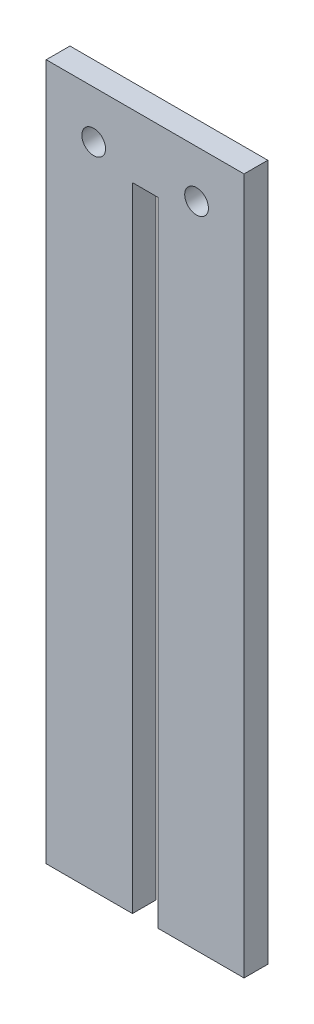
ISO-10303-21;
HEADER;
FILE_DESCRIPTION(('STEP AP214'),'2;1');
FILE_NAME('part.step','',(''),(''),'','','');
FILE_SCHEMA(('AUTOMOTIVE_DESIGN { 1 0 10303 214 1 1 1 1 }'));
ENDSEC;
DATA;
#1=APPLICATION_CONTEXT('core data for automotive mechanical design processes');
#2=APPLICATION_PROTOCOL_DEFINITION('international standard','automotive_design',2000,#1);
#3=PRODUCT_CONTEXT('',#1,'mechanical');
#4=PRODUCT('Part','Part','',(#3));
#5=PRODUCT_RELATED_PRODUCT_CATEGORY('part','',(#4));
#6=PRODUCT_DEFINITION_FORMATION('','',#4);
#7=PRODUCT_DEFINITION_CONTEXT('part definition',#1,'design');
#8=PRODUCT_DEFINITION('design','',#6,#7);
#9=PRODUCT_DEFINITION_SHAPE('','',#8);
#10=(LENGTH_UNIT() NAMED_UNIT(*) SI_UNIT(.MILLI.,.METRE.));
#11=(NAMED_UNIT(*) PLANE_ANGLE_UNIT() SI_UNIT($,.RADIAN.));
#12=(NAMED_UNIT(*) SI_UNIT($,.STERADIAN.) SOLID_ANGLE_UNIT());
#13=UNCERTAINTY_MEASURE_WITH_UNIT(LENGTH_MEASURE(1.E-05),#10,'distance_accuracy_value','');
#14=(GEOMETRIC_REPRESENTATION_CONTEXT(3) GLOBAL_UNCERTAINTY_ASSIGNED_CONTEXT((#13)) GLOBAL_UNIT_ASSIGNED_CONTEXT((#10,
#11,#12)) REPRESENTATION_CONTEXT('',''));
#15=CARTESIAN_POINT('',(0.,0.,0.));
#16=DIRECTION('',(0.,0.,1.));
#17=DIRECTION('',(1.,0.,0.));
#18=AXIS2_PLACEMENT_3D('',#15,#16,#17);
#19=CARTESIAN_POINT('',(0.,0.,3.));
#20=DIRECTION('',(0.,1.,0.));
#21=DIRECTION('',(0.,0.,1.));
#22=AXIS2_PLACEMENT_3D('',#19,#20,#21);
#23=PLANE('',#22);
#24=DIRECTION('',(1.,0.,0.));
#25=VECTOR('',#24,1.);
#26=CARTESIAN_POINT('',(0.,0.,0.));
#27=LINE('',#26,#25);
#28=CARTESIAN_POINT('',(0.,0.,0.));
#29=VERTEX_POINT('',#28);
#30=CARTESIAN_POINT('',(10.9,0.,0.));
#31=VERTEX_POINT('',#30);
#32=EDGE_CURVE('E145',#29,#31,#27,.T.);
#33=ORIENTED_EDGE('',*,*,#32,.T.);
#34=DIRECTION('',(0.,0.,1.));
#35=VECTOR('',#34,1.);
#36=CARTESIAN_POINT('',(10.9,0.,-7.));
#37=LINE('',#36,#35);
#38=CARTESIAN_POINT('',(10.9,0.,3.));
#39=VERTEX_POINT('',#38);
#40=EDGE_CURVE('E179',#31,#39,#37,.T.);
#41=ORIENTED_EDGE('',*,*,#40,.T.);
#42=DIRECTION('',(1.,0.,0.));
#43=VECTOR('',#42,1.);
#44=CARTESIAN_POINT('',(0.,0.,3.));
#45=LINE('',#44,#43);
#46=CARTESIAN_POINT('',(0.,0.,3.));
#47=VERTEX_POINT('',#46);
#48=EDGE_CURVE('E88',#47,#39,#45,.T.);
#49=ORIENTED_EDGE('',*,*,#48,.F.);
#50=DIRECTION('',(0.,0.,-1.));
#51=VECTOR('',#50,1.);
#52=CARTESIAN_POINT('',(0.,0.,3.));
#53=LINE('',#52,#51);
#54=EDGE_CURVE('E155',#47,#29,#53,.T.);
#55=ORIENTED_EDGE('',*,*,#54,.T.);
#56=EDGE_LOOP('',(#33,#41,#49,#55));
#57=FACE_BOUND('',#56,.T.);
#58=ADVANCED_FACE('F35',(#57),#23,.F.);
#59=CARTESIAN_POINT('',(0.,0.,3.));
#60=DIRECTION('',(1.,0.,0.));
#61=DIRECTION('',(0.,1.,0.));
#62=AXIS2_PLACEMENT_3D('',#59,#60,#61);
#63=PLANE('',#62);
#64=DIRECTION('',(0.,-1.,0.));
#65=VECTOR('',#64,1.);
#66=CARTESIAN_POINT('',(0.,0.,0.));
#67=LINE('',#66,#65);
#68=CARTESIAN_POINT('',(0.,88.,0.));
#69=VERTEX_POINT('',#68);
#70=EDGE_CURVE('E140',#69,#29,#67,.T.);
#71=ORIENTED_EDGE('',*,*,#70,.T.);
#72=ORIENTED_EDGE('',*,*,#54,.F.);
#73=DIRECTION('',(0.,-1.,0.));
#74=VECTOR('',#73,1.);
#75=CARTESIAN_POINT('',(0.,0.,3.));
#76=LINE('',#75,#74);
#77=CARTESIAN_POINT('',(0.,88.,3.));
#78=VERTEX_POINT('',#77);
#79=EDGE_CURVE('E131',#78,#47,#76,.T.);
#80=ORIENTED_EDGE('',*,*,#79,.F.);
#81=DIRECTION('',(0.,0.,-1.));
#82=VECTOR('',#81,1.);
#83=CARTESIAN_POINT('',(0.,88.,3.));
#84=LINE('',#83,#82);
#85=EDGE_CURVE('E139',#78,#69,#84,.T.);
#86=ORIENTED_EDGE('',*,*,#85,.T.);
#87=EDGE_LOOP('',(#71,#72,#80,#86));
#88=FACE_BOUND('',#87,.T.);
#89=ADVANCED_FACE('F37',(#88),#63,.F.);
#90=CARTESIAN_POINT('',(14.1,0.,3.));
#91=VERTEX_POINT('',#90);
#92=CARTESIAN_POINT('',(25.,0.,3.));
#93=VERTEX_POINT('',#92);
#94=EDGE_CURVE('E121',#91,#93,#45,.T.);
#95=ORIENTED_EDGE('',*,*,#94,.F.);
#96=DIRECTION('',(0.,0.,1.));
#97=VECTOR('',#96,1.);
#98=CARTESIAN_POINT('',(14.1,0.,-7.));
#99=LINE('',#98,#97);
#100=CARTESIAN_POINT('',(14.1,0.,0.));
#101=VERTEX_POINT('',#100);
#102=EDGE_CURVE('E108',#101,#91,#99,.T.);
#103=ORIENTED_EDGE('',*,*,#102,.F.);
#104=CARTESIAN_POINT('',(25.,0.,0.));
#105=VERTEX_POINT('',#104);
#106=EDGE_CURVE('E143',#101,#105,#27,.T.);
#107=ORIENTED_EDGE('',*,*,#106,.T.);
#108=DIRECTION('',(0.,0.,-1.));
#109=VECTOR('',#108,1.);
#110=CARTESIAN_POINT('',(25.,0.,3.));
#111=LINE('',#110,#109);
#112=EDGE_CURVE('E129',#93,#105,#111,.T.);
#113=ORIENTED_EDGE('',*,*,#112,.F.);
#114=EDGE_LOOP('',(#95,#103,#107,#113));
#115=FACE_BOUND('',#114,.T.);
#116=ADVANCED_FACE('F127',(#115),#23,.F.);
#117=CARTESIAN_POINT('',(25.,0.,3.));
#118=DIRECTION('',(-1.,0.,0.));
#119=DIRECTION('',(0.,-1.,0.));
#120=AXIS2_PLACEMENT_3D('',#117,#118,#119);
#121=PLANE('',#120);
#122=DIRECTION('',(0.,1.,0.));
#123=VECTOR('',#122,1.);
#124=CARTESIAN_POINT('',(25.,0.,0.));
#125=LINE('',#124,#123);
#126=CARTESIAN_POINT('',(25.,88.,0.));
#127=VERTEX_POINT('',#126);
#128=EDGE_CURVE('E148',#105,#127,#125,.T.);
#129=ORIENTED_EDGE('',*,*,#128,.T.);
#130=DIRECTION('',(0.,0.,-1.));
#131=VECTOR('',#130,1.);
#132=CARTESIAN_POINT('',(25.,88.,3.));
#133=LINE('',#132,#131);
#134=CARTESIAN_POINT('',(25.,88.,3.));
#135=VERTEX_POINT('',#134);
#136=EDGE_CURVE('E152',#135,#127,#133,.T.);
#137=ORIENTED_EDGE('',*,*,#136,.F.);
#138=DIRECTION('',(0.,1.,0.));
#139=VECTOR('',#138,1.);
#140=CARTESIAN_POINT('',(25.,0.,3.));
#141=LINE('',#140,#139);
#142=EDGE_CURVE('E133',#93,#135,#141,.T.);
#143=ORIENTED_EDGE('',*,*,#142,.F.);
#144=ORIENTED_EDGE('',*,*,#112,.T.);
#145=EDGE_LOOP('',(#129,#137,#143,#144));
#146=FACE_BOUND('',#145,.T.);
#147=ADVANCED_FACE('F168',(#146),#121,.F.);
#148=CARTESIAN_POINT('',(0.,88.,3.));
#149=DIRECTION('',(0.,-1.,0.));
#150=DIRECTION('',(0.,0.,-1.));
#151=AXIS2_PLACEMENT_3D('',#148,#149,#150);
#152=PLANE('',#151);
#153=DIRECTION('',(-1.,0.,0.));
#154=VECTOR('',#153,1.);
#155=CARTESIAN_POINT('',(0.,88.,0.));
#156=LINE('',#155,#154);
#157=EDGE_CURVE('E80',#127,#69,#156,.T.);
#158=ORIENTED_EDGE('',*,*,#157,.T.);
#159=ORIENTED_EDGE('',*,*,#85,.F.);
#160=DIRECTION('',(-1.,0.,0.));
#161=VECTOR('',#160,1.);
#162=CARTESIAN_POINT('',(0.,88.,3.));
#163=LINE('',#162,#161);
#164=EDGE_CURVE('E59',#135,#78,#163,.T.);
#165=ORIENTED_EDGE('',*,*,#164,.F.);
#166=ORIENTED_EDGE('',*,*,#136,.T.);
#167=EDGE_LOOP('',(#158,#159,#165,#166));
#168=FACE_BOUND('',#167,.T.);
#169=ADVANCED_FACE('F170',(#168),#152,.F.);
#170=CARTESIAN_POINT('',(0.,0.,3.));
#171=DIRECTION('',(0.,0.,-1.));
#172=DIRECTION('',(-1.,0.,0.));
#173=AXIS2_PLACEMENT_3D('',#170,#171,#172);
#174=PLANE('',#173);
#175=CARTESIAN_POINT('',(5.99999999999999,82.,3.));
#176=DIRECTION('',(0.,0.,1.));
#177=DIRECTION('',(1.,0.,0.));
#178=AXIS2_PLACEMENT_3D('',#175,#176,#177);
#179=CIRCLE('',#178,1.5);
#180=CARTESIAN_POINT('',(7.49999999999999,82.,3.));
#181=VERTEX_POINT('',#180);
#182=EDGE_CURVE('E181',#181,#181,#179,.T.);
#183=ORIENTED_EDGE('',*,*,#182,.F.);
#184=EDGE_LOOP('',(#183));
#185=FACE_BOUND('',#184,.T.);
#186=CARTESIAN_POINT('',(19.,82.,3.));
#187=DIRECTION('',(0.,0.,1.));
#188=DIRECTION('',(1.,0.,0.));
#189=AXIS2_PLACEMENT_3D('',#186,#187,#188);
#190=CIRCLE('',#189,1.5);
#191=CARTESIAN_POINT('',(20.5,82.,3.));
#192=VERTEX_POINT('',#191);
#193=EDGE_CURVE('E187',#192,#192,#190,.T.);
#194=ORIENTED_EDGE('',*,*,#193,.F.);
#195=EDGE_LOOP('',(#194));
#196=FACE_BOUND('',#195,.T.);
#197=ORIENTED_EDGE('',*,*,#48,.T.);
#198=DIRECTION('',(0.,-1.,0.));
#199=VECTOR('',#198,1.);
#200=CARTESIAN_POINT('',(10.9,80.,3.));
#201=LINE('',#200,#199);
#202=CARTESIAN_POINT('',(10.9,80.,3.));
#203=VERTEX_POINT('',#202);
#204=EDGE_CURVE('E118',#203,#39,#201,.T.);
#205=ORIENTED_EDGE('',*,*,#204,.F.);
#206=DIRECTION('',(-1.,0.,0.));
#207=VECTOR('',#206,1.);
#208=CARTESIAN_POINT('',(14.1,80.,3.));
#209=LINE('',#208,#207);
#210=CARTESIAN_POINT('',(14.1,80.,3.));
#211=VERTEX_POINT('',#210);
#212=EDGE_CURVE('E125',#211,#203,#209,.T.);
#213=ORIENTED_EDGE('',*,*,#212,.F.);
#214=DIRECTION('',(0.,1.,0.));
#215=VECTOR('',#214,1.);
#216=CARTESIAN_POINT('',(14.1,0.,3.));
#217=LINE('',#216,#215);
#218=EDGE_CURVE('E111',#91,#211,#217,.T.);
#219=ORIENTED_EDGE('',*,*,#218,.F.);
#220=ORIENTED_EDGE('',*,*,#94,.T.);
#221=ORIENTED_EDGE('',*,*,#142,.T.);
#222=ORIENTED_EDGE('',*,*,#164,.T.);
#223=ORIENTED_EDGE('',*,*,#79,.T.);
#224=EDGE_LOOP('',(#197,#205,#213,#219,#220,#221,#222,#223));
#225=FACE_BOUND('',#224,.T.);
#226=ADVANCED_FACE('F120',(#185,#196,#225),#174,.F.);
#227=CARTESIAN_POINT('',(0.,0.,0.));
#228=DIRECTION('',(0.,0.,-1.));
#229=DIRECTION('',(-1.,0.,0.));
#230=AXIS2_PLACEMENT_3D('',#227,#228,#229);
#231=PLANE('',#230);
#232=DIRECTION('',(0.,1.,0.));
#233=VECTOR('',#232,1.);
#234=CARTESIAN_POINT('',(10.9,0.,0.));
#235=LINE('',#234,#233);
#236=CARTESIAN_POINT('',(10.9,80.,0.));
#237=VERTEX_POINT('',#236);
#238=EDGE_CURVE('E11',#31,#237,#235,.T.);
#239=ORIENTED_EDGE('',*,*,#238,.F.);
#240=ORIENTED_EDGE('',*,*,#32,.F.);
#241=ORIENTED_EDGE('',*,*,#70,.F.);
#242=ORIENTED_EDGE('',*,*,#157,.F.);
#243=ORIENTED_EDGE('',*,*,#128,.F.);
#244=ORIENTED_EDGE('',*,*,#106,.F.);
#245=DIRECTION('',(0.,-1.,0.));
#246=VECTOR('',#245,1.);
#247=CARTESIAN_POINT('',(14.1,0.,0.));
#248=LINE('',#247,#246);
#249=CARTESIAN_POINT('',(14.1,80.,0.));
#250=VERTEX_POINT('',#249);
#251=EDGE_CURVE('E114',#250,#101,#248,.T.);
#252=ORIENTED_EDGE('',*,*,#251,.F.);
#253=DIRECTION('',(1.,0.,0.));
#254=VECTOR('',#253,1.);
#255=CARTESIAN_POINT('',(0.,80.,0.));
#256=LINE('',#255,#254);
#257=EDGE_CURVE('E43',#237,#250,#256,.T.);
#258=ORIENTED_EDGE('',*,*,#257,.F.);
#259=EDGE_LOOP('',(#239,#240,#241,#242,#243,#244,#252,#258));
#260=FACE_BOUND('',#259,.T.);
#261=CARTESIAN_POINT('',(5.99999999999999,82.,0.));
#262=DIRECTION('',(0.,0.,1.));
#263=DIRECTION('',(1.,0.,0.));
#264=AXIS2_PLACEMENT_3D('',#261,#262,#263);
#265=CIRCLE('',#264,1.5);
#266=CARTESIAN_POINT('',(7.49999999999999,82.,0.));
#267=VERTEX_POINT('',#266);
#268=EDGE_CURVE('E184',#267,#267,#265,.T.);
#269=ORIENTED_EDGE('',*,*,#268,.T.);
#270=EDGE_LOOP('',(#269));
#271=FACE_BOUND('',#270,.T.);
#272=CARTESIAN_POINT('',(19.,82.,0.));
#273=DIRECTION('',(0.,0.,1.));
#274=DIRECTION('',(1.,0.,0.));
#275=AXIS2_PLACEMENT_3D('',#272,#273,#274);
#276=CIRCLE('',#275,1.5);
#277=CARTESIAN_POINT('',(20.5,82.,0.));
#278=VERTEX_POINT('',#277);
#279=EDGE_CURVE('E144',#278,#278,#276,.T.);
#280=ORIENTED_EDGE('',*,*,#279,.T.);
#281=EDGE_LOOP('',(#280));
#282=FACE_BOUND('',#281,.T.);
#283=ADVANCED_FACE('F164',(#260,#271,#282),#231,.T.);
#284=CARTESIAN_POINT('',(19.,82.,0.));
#285=DIRECTION('',(0.,0.,1.));
#286=DIRECTION('',(1.,0.,0.));
#287=AXIS2_PLACEMENT_3D('',#284,#285,#286);
#288=CYLINDRICAL_SURFACE('',#287,1.5);
#289=ORIENTED_EDGE('',*,*,#279,.F.);
#290=EDGE_LOOP('',(#289));
#291=FACE_BOUND('',#290,.T.);
#292=ORIENTED_EDGE('',*,*,#193,.T.);
#293=EDGE_LOOP('',(#292));
#294=FACE_BOUND('',#293,.T.);
#295=ADVANCED_FACE('F194',(#291,#294),#288,.F.);
#296=CARTESIAN_POINT('',(5.99999999999999,82.,0.));
#297=DIRECTION('',(0.,0.,1.));
#298=DIRECTION('',(1.,0.,0.));
#299=AXIS2_PLACEMENT_3D('',#296,#297,#298);
#300=CYLINDRICAL_SURFACE('',#299,1.5);
#301=ORIENTED_EDGE('',*,*,#268,.F.);
#302=EDGE_LOOP('',(#301));
#303=FACE_BOUND('',#302,.T.);
#304=ORIENTED_EDGE('',*,*,#182,.T.);
#305=EDGE_LOOP('',(#304));
#306=FACE_BOUND('',#305,.T.);
#307=ADVANCED_FACE('F233',(#303,#306),#300,.F.);
#308=CARTESIAN_POINT('',(10.9,80.,-7.));
#309=DIRECTION('',(-1.,0.,0.));
#310=DIRECTION('',(0.,0.,1.));
#311=AXIS2_PLACEMENT_3D('',#308,#309,#310);
#312=PLANE('',#311);
#313=ORIENTED_EDGE('',*,*,#238,.T.);
#314=DIRECTION('',(0.,0.,1.));
#315=VECTOR('',#314,1.);
#316=CARTESIAN_POINT('',(10.9,80.,-7.));
#317=LINE('',#316,#315);
#318=EDGE_CURVE('E161',#237,#203,#317,.T.);
#319=ORIENTED_EDGE('',*,*,#318,.T.);
#320=ORIENTED_EDGE('',*,*,#204,.T.);
#321=ORIENTED_EDGE('',*,*,#40,.F.);
#322=EDGE_LOOP('',(#313,#319,#320,#321));
#323=FACE_BOUND('',#322,.T.);
#324=ADVANCED_FACE('F242',(#323),#312,.F.);
#325=CARTESIAN_POINT('',(14.1,80.,-7.));
#326=DIRECTION('',(0.,1.,0.));
#327=DIRECTION('',(0.,0.,1.));
#328=AXIS2_PLACEMENT_3D('',#325,#326,#327);
#329=PLANE('',#328);
#330=ORIENTED_EDGE('',*,*,#257,.T.);
#331=DIRECTION('',(0.,0.,1.));
#332=VECTOR('',#331,1.);
#333=CARTESIAN_POINT('',(14.1,80.,-7.));
#334=LINE('',#333,#332);
#335=EDGE_CURVE('E50',#250,#211,#334,.T.);
#336=ORIENTED_EDGE('',*,*,#335,.T.);
#337=ORIENTED_EDGE('',*,*,#212,.T.);
#338=ORIENTED_EDGE('',*,*,#318,.F.);
#339=EDGE_LOOP('',(#330,#336,#337,#338));
#340=FACE_BOUND('',#339,.T.);
#341=ADVANCED_FACE('F160',(#340),#329,.F.);
#342=CARTESIAN_POINT('',(14.1,0.,-7.));
#343=DIRECTION('',(1.,0.,0.));
#344=DIRECTION('',(0.,0.,-1.));
#345=AXIS2_PLACEMENT_3D('',#342,#343,#344);
#346=PLANE('',#345);
#347=ORIENTED_EDGE('',*,*,#251,.T.);
#348=ORIENTED_EDGE('',*,*,#102,.T.);
#349=ORIENTED_EDGE('',*,*,#218,.T.);
#350=ORIENTED_EDGE('',*,*,#335,.F.);
#351=EDGE_LOOP('',(#347,#348,#349,#350));
#352=FACE_BOUND('',#351,.T.);
#353=ADVANCED_FACE('F110',(#352),#346,.F.);
#354=CLOSED_SHELL('',(#58,#89,#116,#147,#169,#226,#283,#295,#307,#324,#341,#353));
#355=MANIFOLD_SOLID_BREP('B2',#354);
#356=ADVANCED_BREP_SHAPE_REPRESENTATION('',(#18,#355),#14);
#357=SHAPE_DEFINITION_REPRESENTATION(#9,#356);
ENDSEC;
END-ISO-10303-21;
